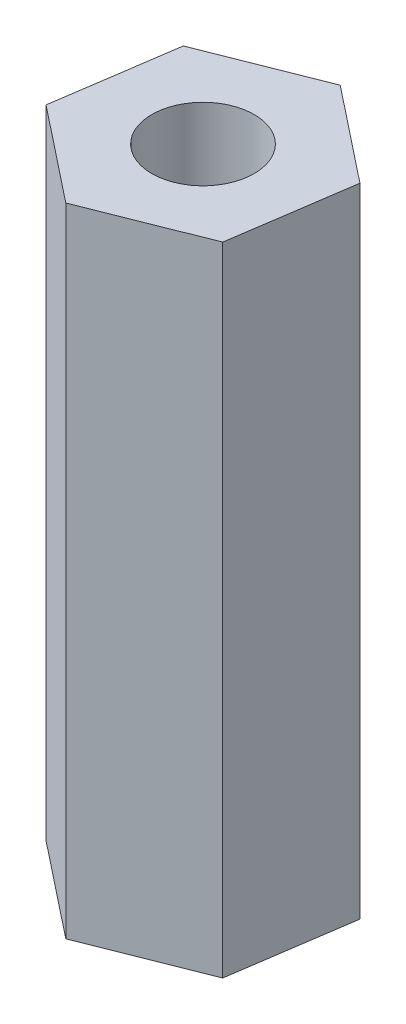
ISO-10303-21;
HEADER;
FILE_DESCRIPTION(('STEP AP214'),'2;1');
FILE_NAME('part.step','',(''),(''),'','','');
FILE_SCHEMA(('AUTOMOTIVE_DESIGN { 1 0 10303 214 1 1 1 1 }'));
ENDSEC;
DATA;
#1=APPLICATION_CONTEXT('core data for automotive mechanical design processes');
#2=APPLICATION_PROTOCOL_DEFINITION('international standard','automotive_design',2000,#1);
#3=PRODUCT_CONTEXT('',#1,'mechanical');
#4=PRODUCT('Part','Part','',(#3));
#5=PRODUCT_RELATED_PRODUCT_CATEGORY('part','',(#4));
#6=PRODUCT_DEFINITION_FORMATION('','',#4);
#7=PRODUCT_DEFINITION_CONTEXT('part definition',#1,'design');
#8=PRODUCT_DEFINITION('design','',#6,#7);
#9=PRODUCT_DEFINITION_SHAPE('','',#8);
#10=(LENGTH_UNIT() NAMED_UNIT(*) SI_UNIT(.MILLI.,.METRE.));
#11=(NAMED_UNIT(*) PLANE_ANGLE_UNIT() SI_UNIT($,.RADIAN.));
#12=(NAMED_UNIT(*) SI_UNIT($,.STERADIAN.) SOLID_ANGLE_UNIT());
#13=UNCERTAINTY_MEASURE_WITH_UNIT(LENGTH_MEASURE(1.E-05),#10,'distance_accuracy_value','');
#14=(GEOMETRIC_REPRESENTATION_CONTEXT(3) GLOBAL_UNCERTAINTY_ASSIGNED_CONTEXT((#13)) GLOBAL_UNIT_ASSIGNED_CONTEXT((#10,
#11,#12)) REPRESENTATION_CONTEXT('',''));
#15=CARTESIAN_POINT('',(0.,0.,0.));
#16=DIRECTION('',(0.,0.,1.));
#17=DIRECTION('',(1.,0.,0.));
#18=AXIS2_PLACEMENT_3D('',#15,#16,#17);
#19=CARTESIAN_POINT('',(-0.386477916077778,14.,2.62754032389945));
#20=DIRECTION('',(-0.368652129532225,0.,-0.929567430255253));
#21=DIRECTION('',(-0.929567430255254,0.,0.368652129532225));
#22=AXIS2_PLACEMENT_3D('',#19,#20,#21);
#23=PLANE('',#22);
#24=DIRECTION('',(0.929567430255254,0.,-0.368652129532225));
#25=VECTOR('',#24,1.);
#26=CARTESIAN_POINT('',(-0.386477916077778,0.,2.62754032389945));
#27=LINE('',#26,#25);
#28=CARTESIAN_POINT('',(-0.386477916077778,0.,2.62754032389945));
#29=VERTEX_POINT('',#28);
#30=CARTESIAN_POINT('',(2.08227771192603,0.,1.64846985527475));
#31=VERTEX_POINT('',#30);
#32=EDGE_CURVE('E117',#29,#31,#27,.T.);
#33=ORIENTED_EDGE('',*,*,#32,.T.);
#34=DIRECTION('',(0.,-1.,0.));
#35=VECTOR('',#34,1.);
#36=CARTESIAN_POINT('',(2.08227771192603,14.,1.64846985527475));
#37=LINE('',#36,#35);
#38=CARTESIAN_POINT('',(2.08227771192603,14.,1.64846985527475));
#39=VERTEX_POINT('',#38);
#40=EDGE_CURVE('E11',#39,#31,#37,.T.);
#41=ORIENTED_EDGE('',*,*,#40,.F.);
#42=DIRECTION('',(0.929567430255254,0.,-0.368652129532225));
#43=VECTOR('',#42,1.);
#44=CARTESIAN_POINT('',(-0.386477916077778,14.,2.62754032389945));
#45=LINE('',#44,#43);
#46=CARTESIAN_POINT('',(-0.386477916077778,14.,2.62754032389945));
#47=VERTEX_POINT('',#46);
#48=EDGE_CURVE('E128',#47,#39,#45,.T.);
#49=ORIENTED_EDGE('',*,*,#48,.F.);
#50=DIRECTION('',(0.,-1.,0.));
#51=VECTOR('',#50,1.);
#52=CARTESIAN_POINT('',(-0.386477916077778,14.,2.62754032389945));
#53=LINE('',#52,#51);
#54=EDGE_CURVE('E113',#47,#29,#53,.T.);
#55=ORIENTED_EDGE('',*,*,#54,.T.);
#56=EDGE_LOOP('',(#33,#41,#49,#55));
#57=FACE_BOUND('',#56,.T.);
#58=ADVANCED_FACE('F33',(#57),#23,.F.);
#59=CARTESIAN_POINT('',(2.08227771192603,14.,1.64846985527475));
#60=DIRECTION('',(-0.989355073897781,0.,-0.145521605793488));
#61=DIRECTION('',(-0.145521605793488,0.,0.989355073897781));
#62=AXIS2_PLACEMENT_3D('',#59,#60,#61);
#63=PLANE('',#62);
#64=DIRECTION('',(0.145521605793488,0.,-0.989355073897781));
#65=VECTOR('',#64,1.);
#66=CARTESIAN_POINT('',(2.08227771192603,0.,1.64846985527475));
#67=LINE('',#66,#65);
#68=CARTESIAN_POINT('',(2.46875562800381,0.,-0.9790704686247));
#69=VERTEX_POINT('',#68);
#70=EDGE_CURVE('E120',#31,#69,#67,.T.);
#71=ORIENTED_EDGE('',*,*,#70,.T.);
#72=DIRECTION('',(0.,-1.,0.));
#73=VECTOR('',#72,1.);
#74=CARTESIAN_POINT('',(2.46875562800381,14.,-0.9790704686247));
#75=LINE('',#74,#73);
#76=CARTESIAN_POINT('',(2.46875562800381,14.,-0.9790704686247));
#77=VERTEX_POINT('',#76);
#78=EDGE_CURVE('E41',#77,#69,#75,.T.);
#79=ORIENTED_EDGE('',*,*,#78,.F.);
#80=DIRECTION('',(0.145521605793488,0.,-0.989355073897781));
#81=VECTOR('',#80,1.);
#82=CARTESIAN_POINT('',(2.08227771192603,14.,1.64846985527475));
#83=LINE('',#82,#81);
#84=EDGE_CURVE('E86',#39,#77,#83,.T.);
#85=ORIENTED_EDGE('',*,*,#84,.F.);
#86=ORIENTED_EDGE('',*,*,#40,.T.);
#87=EDGE_LOOP('',(#71,#79,#85,#86));
#88=FACE_BOUND('',#87,.T.);
#89=ADVANCED_FACE('F153',(#88),#63,.F.);
#90=CARTESIAN_POINT('',(2.46875562800381,14.,-0.9790704686247));
#91=DIRECTION('',(-0.620702944365557,0.,0.784045824461765));
#92=DIRECTION('',(0.784045824461765,0.,0.620702944365557));
#93=AXIS2_PLACEMENT_3D('',#90,#91,#92);
#94=PLANE('',#93);
#95=DIRECTION('',(-0.784045824461765,0.,-0.620702944365557));
#96=VECTOR('',#95,1.);
#97=CARTESIAN_POINT('',(2.46875562800381,0.,-0.9790704686247));
#98=LINE('',#97,#96);
#99=CARTESIAN_POINT('',(0.386477916077779,0.,-2.62754032389945));
#100=VERTEX_POINT('',#99);
#101=EDGE_CURVE('E123',#69,#100,#98,.T.);
#102=ORIENTED_EDGE('',*,*,#101,.T.);
#103=DIRECTION('',(0.,-1.,0.));
#104=VECTOR('',#103,1.);
#105=CARTESIAN_POINT('',(0.386477916077779,14.,-2.62754032389945));
#106=LINE('',#105,#104);
#107=CARTESIAN_POINT('',(0.386477916077779,14.,-2.62754032389945));
#108=VERTEX_POINT('',#107);
#109=EDGE_CURVE('E108',#108,#100,#106,.T.);
#110=ORIENTED_EDGE('',*,*,#109,.F.);
#111=DIRECTION('',(-0.784045824461765,0.,-0.620702944365557));
#112=VECTOR('',#111,1.);
#113=CARTESIAN_POINT('',(2.46875562800381,14.,-0.9790704686247));
#114=LINE('',#113,#112);
#115=EDGE_CURVE('E99',#77,#108,#114,.T.);
#116=ORIENTED_EDGE('',*,*,#115,.F.);
#117=ORIENTED_EDGE('',*,*,#78,.T.);
#118=EDGE_LOOP('',(#102,#110,#116,#117));
#119=FACE_BOUND('',#118,.T.);
#120=ADVANCED_FACE('F134',(#119),#94,.F.);
#121=CARTESIAN_POINT('',(0.386477916077779,14.,-2.62754032389945));
#122=DIRECTION('',(0.368652129532225,0.,0.929567430255253));
#123=DIRECTION('',(0.929567430255254,0.,-0.368652129532225));
#124=AXIS2_PLACEMENT_3D('',#121,#122,#123);
#125=PLANE('',#124);
#126=DIRECTION('',(-0.929567430255254,0.,0.368652129532225));
#127=VECTOR('',#126,1.);
#128=CARTESIAN_POINT('',(0.386477916077779,0.,-2.62754032389945));
#129=LINE('',#128,#127);
#130=CARTESIAN_POINT('',(-2.08227771192603,0.,-1.64846985527475));
#131=VERTEX_POINT('',#130);
#132=EDGE_CURVE('E107',#100,#131,#129,.T.);
#133=ORIENTED_EDGE('',*,*,#132,.T.);
#134=DIRECTION('',(0.,-1.,0.));
#135=VECTOR('',#134,1.);
#136=CARTESIAN_POINT('',(-2.08227771192603,14.,-1.64846985527475));
#137=LINE('',#136,#135);
#138=CARTESIAN_POINT('',(-2.08227771192603,14.,-1.64846985527475));
#139=VERTEX_POINT('',#138);
#140=EDGE_CURVE('E104',#139,#131,#137,.T.);
#141=ORIENTED_EDGE('',*,*,#140,.F.);
#142=DIRECTION('',(-0.929567430255254,0.,0.368652129532225));
#143=VECTOR('',#142,1.);
#144=CARTESIAN_POINT('',(0.386477916077779,14.,-2.62754032389945));
#145=LINE('',#144,#143);
#146=EDGE_CURVE('E93',#108,#139,#145,.T.);
#147=ORIENTED_EDGE('',*,*,#146,.F.);
#148=ORIENTED_EDGE('',*,*,#109,.T.);
#149=EDGE_LOOP('',(#133,#141,#147,#148));
#150=FACE_BOUND('',#149,.T.);
#151=ADVANCED_FACE('F105',(#150),#125,.F.);
#152=CARTESIAN_POINT('',(-2.08227771192603,14.,-1.64846985527475));
#153=DIRECTION('',(0.989355073897782,0.,0.145521605793488));
#154=DIRECTION('',(0.145521605793488,0.,-0.989355073897782));
#155=AXIS2_PLACEMENT_3D('',#152,#153,#154);
#156=PLANE('',#155);
#157=DIRECTION('',(-0.145521605793488,0.,0.989355073897782));
#158=VECTOR('',#157,1.);
#159=CARTESIAN_POINT('',(-2.08227771192603,0.,-1.64846985527475));
#160=LINE('',#159,#158);
#161=CARTESIAN_POINT('',(-2.46875562800381,0.,0.9790704686247));
#162=VERTEX_POINT('',#161);
#163=EDGE_CURVE('E72',#131,#162,#160,.T.);
#164=ORIENTED_EDGE('',*,*,#163,.T.);
#165=DIRECTION('',(0.,-1.,0.));
#166=VECTOR('',#165,1.);
#167=CARTESIAN_POINT('',(-2.46875562800381,14.,0.9790704686247));
#168=LINE('',#167,#166);
#169=CARTESIAN_POINT('',(-2.46875562800381,14.,0.9790704686247));
#170=VERTEX_POINT('',#169);
#171=EDGE_CURVE('E109',#170,#162,#168,.T.);
#172=ORIENTED_EDGE('',*,*,#171,.F.);
#173=DIRECTION('',(-0.145521605793488,0.,0.989355073897782));
#174=VECTOR('',#173,1.);
#175=CARTESIAN_POINT('',(-2.08227771192603,14.,-1.64846985527475));
#176=LINE('',#175,#174);
#177=EDGE_CURVE('E97',#139,#170,#176,.T.);
#178=ORIENTED_EDGE('',*,*,#177,.F.);
#179=ORIENTED_EDGE('',*,*,#140,.T.);
#180=EDGE_LOOP('',(#164,#172,#178,#179));
#181=FACE_BOUND('',#180,.T.);
#182=ADVANCED_FACE('F111',(#181),#156,.F.);
#183=CARTESIAN_POINT('',(-2.46875562800381,14.,0.9790704686247));
#184=DIRECTION('',(0.620702944365556,0.,-0.784045824461765));
#185=DIRECTION('',(-0.784045824461765,0.,-0.620702944365556));
#186=AXIS2_PLACEMENT_3D('',#183,#184,#185);
#187=PLANE('',#186);
#188=DIRECTION('',(0.784045824461765,0.,0.620702944365556));
#189=VECTOR('',#188,1.);
#190=CARTESIAN_POINT('',(-2.46875562800381,0.,0.9790704686247));
#191=LINE('',#190,#189);
#192=EDGE_CURVE('E78',#162,#29,#191,.T.);
#193=ORIENTED_EDGE('',*,*,#192,.T.);
#194=ORIENTED_EDGE('',*,*,#54,.F.);
#195=DIRECTION('',(0.784045824461765,0.,0.620702944365556));
#196=VECTOR('',#195,1.);
#197=CARTESIAN_POINT('',(-2.46875562800381,14.,0.9790704686247));
#198=LINE('',#197,#196);
#199=EDGE_CURVE('E49',#170,#47,#198,.T.);
#200=ORIENTED_EDGE('',*,*,#199,.F.);
#201=ORIENTED_EDGE('',*,*,#171,.T.);
#202=EDGE_LOOP('',(#193,#194,#200,#201));
#203=FACE_BOUND('',#202,.T.);
#204=ADVANCED_FACE('F141',(#203),#187,.F.);
#205=CARTESIAN_POINT('',(0.,14.,0.));
#206=DIRECTION('',(0.,1.,0.));
#207=DIRECTION('',(0.,0.,1.));
#208=AXIS2_PLACEMENT_3D('',#205,#206,#207);
#209=PLANE('',#208);
#210=CARTESIAN_POINT('',(0.,14.,0.));
#211=DIRECTION('',(0.,1.,0.));
#212=DIRECTION('',(0.,0.,1.));
#213=AXIS2_PLACEMENT_3D('',#210,#211,#212);
#214=CIRCLE('',#213,1.125);
#215=CARTESIAN_POINT('',(0.,14.,1.125));
#216=VERTEX_POINT('',#215);
#217=EDGE_CURVE('E208',#216,#216,#214,.T.);
#218=ORIENTED_EDGE('',*,*,#217,.F.);
#219=EDGE_LOOP('',(#218));
#220=FACE_BOUND('',#219,.T.);
#221=ORIENTED_EDGE('',*,*,#48,.T.);
#222=ORIENTED_EDGE('',*,*,#84,.T.);
#223=ORIENTED_EDGE('',*,*,#115,.T.);
#224=ORIENTED_EDGE('',*,*,#146,.T.);
#225=ORIENTED_EDGE('',*,*,#177,.T.);
#226=ORIENTED_EDGE('',*,*,#199,.T.);
#227=EDGE_LOOP('',(#221,#222,#223,#224,#225,#226));
#228=FACE_BOUND('',#227,.T.);
#229=ADVANCED_FACE('F95',(#220,#228),#209,.T.);
#230=CARTESIAN_POINT('',(0.,0.,0.));
#231=DIRECTION('',(0.,1.,0.));
#232=DIRECTION('',(0.,0.,1.));
#233=AXIS2_PLACEMENT_3D('',#230,#231,#232);
#234=PLANE('',#233);
#235=CARTESIAN_POINT('',(0.,0.,0.));
#236=DIRECTION('',(0.,1.,0.));
#237=DIRECTION('',(0.,0.,1.));
#238=AXIS2_PLACEMENT_3D('',#235,#236,#237);
#239=CIRCLE('',#238,1.125);
#240=CARTESIAN_POINT('',(0.,0.,1.125));
#241=VERTEX_POINT('',#240);
#242=EDGE_CURVE('E121',#241,#241,#239,.T.);
#243=ORIENTED_EDGE('',*,*,#242,.T.);
#244=EDGE_LOOP('',(#243));
#245=FACE_BOUND('',#244,.T.);
#246=ORIENTED_EDGE('',*,*,#32,.F.);
#247=ORIENTED_EDGE('',*,*,#192,.F.);
#248=ORIENTED_EDGE('',*,*,#163,.F.);
#249=ORIENTED_EDGE('',*,*,#132,.F.);
#250=ORIENTED_EDGE('',*,*,#101,.F.);
#251=ORIENTED_EDGE('',*,*,#70,.F.);
#252=EDGE_LOOP('',(#246,#247,#248,#249,#250,#251));
#253=FACE_BOUND('',#252,.T.);
#254=ADVANCED_FACE('F137',(#245,#253),#234,.F.);
#255=CARTESIAN_POINT('',(0.,0.,0.));
#256=DIRECTION('',(0.,1.,0.));
#257=DIRECTION('',(0.,0.,1.));
#258=AXIS2_PLACEMENT_3D('',#255,#256,#257);
#259=CYLINDRICAL_SURFACE('',#258,1.125);
#260=ORIENTED_EDGE('',*,*,#242,.F.);
#261=EDGE_LOOP('',(#260));
#262=FACE_BOUND('',#261,.T.);
#263=ORIENTED_EDGE('',*,*,#217,.T.);
#264=EDGE_LOOP('',(#263));
#265=FACE_BOUND('',#264,.T.);
#266=ADVANCED_FACE('F190',(#262,#265),#259,.F.);
#267=CLOSED_SHELL('',(#58,#89,#120,#151,#182,#204,#229,#254,#266));
#268=MANIFOLD_SOLID_BREP('B2',#267);
#269=ADVANCED_BREP_SHAPE_REPRESENTATION('',(#18,#268),#14);
#270=SHAPE_DEFINITION_REPRESENTATION(#9,#269);
ENDSEC;
END-ISO-10303-21;
